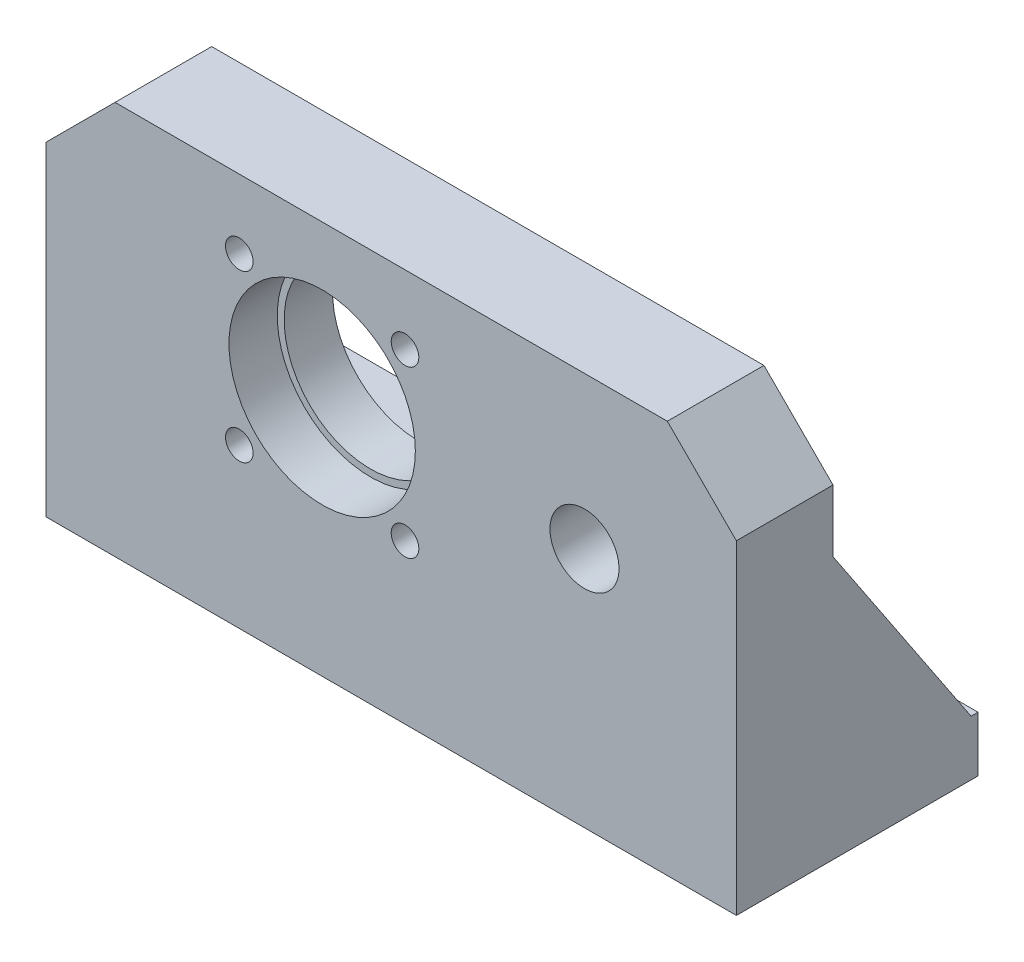
ISO-10303-21;
HEADER;
FILE_DESCRIPTION(('STEP AP214'),'2;1');
FILE_NAME('part.step','',(''),(''),'','','');
FILE_SCHEMA(('AUTOMOTIVE_DESIGN { 1 0 10303 214 1 1 1 1 }'));
ENDSEC;
DATA;
#1=APPLICATION_CONTEXT('core data for automotive mechanical design processes');
#2=APPLICATION_PROTOCOL_DEFINITION('international standard','automotive_design',2000,#1);
#3=PRODUCT_CONTEXT('',#1,'mechanical');
#4=PRODUCT('Part','Part','',(#3));
#5=PRODUCT_RELATED_PRODUCT_CATEGORY('part','',(#4));
#6=PRODUCT_DEFINITION_FORMATION('','',#4);
#7=PRODUCT_DEFINITION_CONTEXT('part definition',#1,'design');
#8=PRODUCT_DEFINITION('design','',#6,#7);
#9=PRODUCT_DEFINITION_SHAPE('','',#8);
#10=(LENGTH_UNIT() NAMED_UNIT(*) SI_UNIT(.MILLI.,.METRE.));
#11=(NAMED_UNIT(*) PLANE_ANGLE_UNIT() SI_UNIT($,.RADIAN.));
#12=(NAMED_UNIT(*) SI_UNIT($,.STERADIAN.) SOLID_ANGLE_UNIT());
#13=UNCERTAINTY_MEASURE_WITH_UNIT(LENGTH_MEASURE(1.E-05),#10,'distance_accuracy_value','');
#14=(GEOMETRIC_REPRESENTATION_CONTEXT(3) GLOBAL_UNCERTAINTY_ASSIGNED_CONTEXT((#13)) GLOBAL_UNIT_ASSIGNED_CONTEXT((#10,
#11,#12)) REPRESENTATION_CONTEXT('',''));
#15=CARTESIAN_POINT('',(0.,0.,0.));
#16=DIRECTION('',(0.,0.,1.));
#17=DIRECTION('',(1.,0.,0.));
#18=AXIS2_PLACEMENT_3D('',#15,#16,#17);
#19=CARTESIAN_POINT('',(0.,0.,-14.));
#20=DIRECTION('',(0.,0.,-1.));
#21=DIRECTION('',(1.,0.,0.));
#22=AXIS2_PLACEMENT_3D('',#19,#20,#21);
#23=PLANE('',#22);
#24=CARTESIAN_POINT('',(38.,0.,-14.));
#25=DIRECTION('',(0.,0.,1.));
#26=DIRECTION('',(1.,0.,0.));
#27=AXIS2_PLACEMENT_3D('',#24,#25,#26);
#28=CIRCLE('',#27,5.);
#29=CARTESIAN_POINT('',(43.,0.,-14.));
#30=VERTEX_POINT('',#29);
#31=EDGE_CURVE('E163',#30,#30,#28,.T.);
#32=ORIENTED_EDGE('',*,*,#31,.T.);
#33=EDGE_LOOP('',(#32));
#34=FACE_BOUND('',#33,.T.);
#35=CARTESIAN_POINT('',(0.,0.,-14.));
#36=DIRECTION('',(0.,0.,1.));
#37=DIRECTION('',(1.,0.,0.));
#38=AXIS2_PLACEMENT_3D('',#35,#36,#37);
#39=CIRCLE('',#38,12.5);
#40=CARTESIAN_POINT('',(12.5,0.,-14.));
#41=VERTEX_POINT('',#40);
#42=EDGE_CURVE('E254',#41,#41,#39,.T.);
#43=ORIENTED_EDGE('',*,*,#42,.T.);
#44=EDGE_LOOP('',(#43));
#45=FACE_BOUND('',#44,.T.);
#46=DIRECTION('',(-1.,0.,0.));
#47=VECTOR('',#46,1.);
#48=CARTESIAN_POINT('',(60.,22.,-14.));
#49=LINE('',#48,#47);
#50=CARTESIAN_POINT('',(50.,22.,-14.));
#51=VERTEX_POINT('',#50);
#52=CARTESIAN_POINT('',(-30.,22.,-14.));
#53=VERTEX_POINT('',#52);
#54=EDGE_CURVE('E279',#51,#53,#49,.T.);
#55=ORIENTED_EDGE('',*,*,#54,.F.);
#56=DIRECTION('',(-0.707106781186549,0.707106781186546,0.));
#57=VECTOR('',#56,1.);
#58=CARTESIAN_POINT('',(35.9999999999999,36.,-14.));
#59=LINE('',#58,#57);
#60=CARTESIAN_POINT('',(60.,12.,-14.));
#61=VERTEX_POINT('',#60);
#62=EDGE_CURVE('E52',#51,#61,#59,.F.);
#63=ORIENTED_EDGE('',*,*,#62,.T.);
#64=DIRECTION('',(0.,1.,0.));
#65=VECTOR('',#64,1.);
#66=CARTESIAN_POINT('',(60.,-35.,-14.));
#67=LINE('',#66,#65);
#68=CARTESIAN_POINT('',(60.,2.99999999999999,-14.));
#69=VERTEX_POINT('',#68);
#70=EDGE_CURVE('E274',#69,#61,#67,.T.);
#71=ORIENTED_EDGE('',*,*,#70,.F.);
#72=DIRECTION('',(1.,0.,0.));
#73=VECTOR('',#72,1.);
#74=CARTESIAN_POINT('',(52.,2.99999999999999,-14.));
#75=LINE('',#74,#73);
#76=CARTESIAN_POINT('',(52.,2.99999999999999,-14.));
#77=VERTEX_POINT('',#76);
#78=EDGE_CURVE('E218',#77,#69,#75,.T.);
#79=ORIENTED_EDGE('',*,*,#78,.F.);
#80=DIRECTION('',(0.,1.,0.));
#81=VECTOR('',#80,1.);
#82=CARTESIAN_POINT('',(52.,-27.,-14.));
#83=LINE('',#82,#81);
#84=CARTESIAN_POINT('',(52.,-27.,-14.));
#85=VERTEX_POINT('',#84);
#86=EDGE_CURVE('E211',#85,#77,#83,.T.);
#87=ORIENTED_EDGE('',*,*,#86,.F.);
#88=DIRECTION('',(-1.,0.,0.));
#89=VECTOR('',#88,1.);
#90=CARTESIAN_POINT('',(0.,-27.,-14.));
#91=LINE('',#90,#89);
#92=CARTESIAN_POINT('',(-32.,-27.,-14.));
#93=VERTEX_POINT('',#92);
#94=EDGE_CURVE('E248',#85,#93,#91,.T.);
#95=ORIENTED_EDGE('',*,*,#94,.T.);
#96=DIRECTION('',(0.,1.,0.));
#97=VECTOR('',#96,1.);
#98=CARTESIAN_POINT('',(-32.,-27.,-14.));
#99=LINE('',#98,#97);
#100=CARTESIAN_POINT('',(-32.,2.99999999999998,-14.));
#101=VERTEX_POINT('',#100);
#102=EDGE_CURVE('E193',#93,#101,#99,.T.);
#103=ORIENTED_EDGE('',*,*,#102,.T.);
#104=DIRECTION('',(-1.,0.,0.));
#105=VECTOR('',#104,1.);
#106=CARTESIAN_POINT('',(-32.,2.99999999999998,-14.));
#107=LINE('',#106,#105);
#108=CARTESIAN_POINT('',(-40.,2.99999999999998,-14.));
#109=VERTEX_POINT('',#108);
#110=EDGE_CURVE('E200',#101,#109,#107,.T.);
#111=ORIENTED_EDGE('',*,*,#110,.T.);
#112=DIRECTION('',(0.,-1.,0.));
#113=VECTOR('',#112,1.);
#114=CARTESIAN_POINT('',(-40.,22.,-14.));
#115=LINE('',#114,#113);
#116=CARTESIAN_POINT('',(-40.,11.9999999999999,-14.));
#117=VERTEX_POINT('',#116);
#118=EDGE_CURVE('E271',#117,#109,#115,.T.);
#119=ORIENTED_EDGE('',*,*,#118,.F.);
#120=DIRECTION('',(-0.707106781186546,-0.707106781186549,0.));
#121=VECTOR('',#120,1.);
#122=CARTESIAN_POINT('',(-26.,26.,-14.));
#123=LINE('',#122,#121);
#124=EDGE_CURVE('E64',#117,#53,#123,.F.);
#125=ORIENTED_EDGE('',*,*,#124,.T.);
#126=EDGE_LOOP('',(#55,#63,#71,#79,#87,#95,#103,#111,#119,#125));
#127=FACE_BOUND('',#126,.T.);
#128=ADVANCED_FACE('F42',(#34,#45,#127),#23,.T.);
#129=CARTESIAN_POINT('',(0.,-27.,0.));
#130=DIRECTION('',(0.,1.,0.));
#131=DIRECTION('',(0.,0.,-1.));
#132=AXIS2_PLACEMENT_3D('',#129,#130,#131);
#133=PLANE('',#132);
#134=DIRECTION('',(0.,0.,1.));
#135=VECTOR('',#134,1.);
#136=CARTESIAN_POINT('',(-32.,-27.,-34.));
#137=LINE('',#136,#135);
#138=CARTESIAN_POINT('',(-32.,-27.,-34.));
#139=VERTEX_POINT('',#138);
#140=EDGE_CURVE('E187',#139,#93,#137,.T.);
#141=ORIENTED_EDGE('',*,*,#140,.T.);
#142=ORIENTED_EDGE('',*,*,#94,.F.);
#143=DIRECTION('',(0.,0.,1.));
#144=VECTOR('',#143,1.);
#145=CARTESIAN_POINT('',(52.,-27.,-34.));
#146=LINE('',#145,#144);
#147=CARTESIAN_POINT('',(52.,-27.,-34.));
#148=VERTEX_POINT('',#147);
#149=EDGE_CURVE('E208',#148,#85,#146,.T.);
#150=ORIENTED_EDGE('',*,*,#149,.F.);
#151=DIRECTION('',(1.,0.,0.));
#152=VECTOR('',#151,1.);
#153=CARTESIAN_POINT('',(52.,-27.,-34.));
#154=LINE('',#153,#152);
#155=CARTESIAN_POINT('',(60.,-27.,-34.));
#156=VERTEX_POINT('',#155);
#157=EDGE_CURVE('E221',#148,#156,#154,.T.);
#158=ORIENTED_EDGE('',*,*,#157,.T.);
#159=DIRECTION('',(0.,0.,-1.));
#160=VECTOR('',#159,1.);
#161=CARTESIAN_POINT('',(60.,-27.,0.));
#162=LINE('',#161,#160);
#163=CARTESIAN_POINT('',(60.,-27.,-35.));
#164=VERTEX_POINT('',#163);
#165=EDGE_CURVE('E233',#156,#164,#162,.T.);
#166=ORIENTED_EDGE('',*,*,#165,.T.);
#167=DIRECTION('',(-1.,0.,0.));
#168=VECTOR('',#167,1.);
#169=CARTESIAN_POINT('',(-40.,-27.,-35.));
#170=LINE('',#169,#168);
#171=CARTESIAN_POINT('',(-40.,-27.,-35.));
#172=VERTEX_POINT('',#171);
#173=EDGE_CURVE('E237',#164,#172,#170,.T.);
#174=ORIENTED_EDGE('',*,*,#173,.T.);
#175=DIRECTION('',(0.,0.,1.));
#176=VECTOR('',#175,1.);
#177=CARTESIAN_POINT('',(-40.,-27.,0.));
#178=LINE('',#177,#176);
#179=CARTESIAN_POINT('',(-40.,-27.,-34.));
#180=VERTEX_POINT('',#179);
#181=EDGE_CURVE('E229',#172,#180,#178,.T.);
#182=ORIENTED_EDGE('',*,*,#181,.T.);
#183=DIRECTION('',(-1.,0.,0.));
#184=VECTOR('',#183,1.);
#185=CARTESIAN_POINT('',(-32.,-27.,-34.));
#186=LINE('',#185,#184);
#187=EDGE_CURVE('E197',#139,#180,#186,.T.);
#188=ORIENTED_EDGE('',*,*,#187,.F.);
#189=EDGE_LOOP('',(#141,#142,#150,#158,#166,#174,#182,#188));
#190=FACE_BOUND('',#189,.T.);
#191=ADVANCED_FACE('F352',(#190),#133,.T.);
#192=CARTESIAN_POINT('',(0.,0.,-14.));
#193=DIRECTION('',(0.,0.,1.));
#194=DIRECTION('',(-1.,0.,0.));
#195=AXIS2_PLACEMENT_3D('',#192,#193,#194);
#196=CYLINDRICAL_SURFACE('',#195,13.5);
#197=CARTESIAN_POINT('',(0.,0.,0.));
#198=DIRECTION('',(0.,0.,1.));
#199=DIRECTION('',(1.,0.,0.));
#200=AXIS2_PLACEMENT_3D('',#197,#198,#199);
#201=CIRCLE('',#200,13.5);
#202=CARTESIAN_POINT('',(13.5,0.,0.));
#203=VERTEX_POINT('',#202);
#204=EDGE_CURVE('E266',#203,#203,#201,.T.);
#205=ORIENTED_EDGE('',*,*,#204,.T.);
#206=EDGE_LOOP('',(#205));
#207=FACE_BOUND('',#206,.T.);
#208=CARTESIAN_POINT('',(0.,0.,-7.));
#209=DIRECTION('',(0.,0.,1.));
#210=DIRECTION('',(1.,0.,0.));
#211=AXIS2_PLACEMENT_3D('',#208,#209,#210);
#212=CIRCLE('',#211,13.5);
#213=CARTESIAN_POINT('',(13.5,0.,-7.));
#214=VERTEX_POINT('',#213);
#215=EDGE_CURVE('E259',#214,#214,#212,.T.);
#216=ORIENTED_EDGE('',*,*,#215,.F.);
#217=EDGE_LOOP('',(#216));
#218=FACE_BOUND('',#217,.T.);
#219=ADVANCED_FACE('F387',(#207,#218),#196,.F.);
#220=CARTESIAN_POINT('',(0.,0.,0.));
#221=DIRECTION('',(0.,0.,-1.));
#222=DIRECTION('',(1.,0.,0.));
#223=AXIS2_PLACEMENT_3D('',#220,#221,#222);
#224=PLANE('',#223);
#225=CARTESIAN_POINT('',(38.,0.,0.));
#226=DIRECTION('',(0.,0.,-1.));
#227=DIRECTION('',(-1.,0.,0.));
#228=AXIS2_PLACEMENT_3D('',#225,#226,#227);
#229=CIRCLE('',#228,5.);
#230=CARTESIAN_POINT('',(33.,0.,0.));
#231=VERTEX_POINT('',#230);
#232=EDGE_CURVE('E650',#231,#231,#229,.T.);
#233=ORIENTED_EDGE('',*,*,#232,.T.);
#234=EDGE_LOOP('',(#233));
#235=FACE_BOUND('',#234,.T.);
#236=CARTESIAN_POINT('',(12.,12.,0.));
#237=DIRECTION('',(0.,0.,-1.));
#238=DIRECTION('',(-1.,0.,0.));
#239=AXIS2_PLACEMENT_3D('',#236,#237,#238);
#240=CIRCLE('',#239,1.99999999999999);
#241=CARTESIAN_POINT('',(10.,12.,0.));
#242=VERTEX_POINT('',#241);
#243=EDGE_CURVE('E155',#242,#242,#240,.T.);
#244=ORIENTED_EDGE('',*,*,#243,.T.);
#245=EDGE_LOOP('',(#244));
#246=FACE_BOUND('',#245,.T.);
#247=CARTESIAN_POINT('',(-12.,12.,0.));
#248=DIRECTION('',(0.,0.,-1.));
#249=DIRECTION('',(-1.,0.,0.));
#250=AXIS2_PLACEMENT_3D('',#247,#248,#249);
#251=CIRCLE('',#250,1.99999999999999);
#252=CARTESIAN_POINT('',(-14.,12.,0.));
#253=VERTEX_POINT('',#252);
#254=EDGE_CURVE('E154',#253,#253,#251,.T.);
#255=ORIENTED_EDGE('',*,*,#254,.T.);
#256=EDGE_LOOP('',(#255));
#257=FACE_BOUND('',#256,.T.);
#258=CARTESIAN_POINT('',(-12.,-12.,0.));
#259=DIRECTION('',(0.,0.,-1.));
#260=DIRECTION('',(-1.,0.,0.));
#261=AXIS2_PLACEMENT_3D('',#258,#259,#260);
#262=CIRCLE('',#261,1.99999999999999);
#263=CARTESIAN_POINT('',(-14.,-12.,0.));
#264=VERTEX_POINT('',#263);
#265=EDGE_CURVE('E170',#264,#264,#262,.T.);
#266=ORIENTED_EDGE('',*,*,#265,.T.);
#267=EDGE_LOOP('',(#266));
#268=FACE_BOUND('',#267,.T.);
#269=CARTESIAN_POINT('',(12.,-12.,0.));
#270=DIRECTION('',(0.,0.,-1.));
#271=DIRECTION('',(-1.,0.,0.));
#272=AXIS2_PLACEMENT_3D('',#269,#270,#271);
#273=CIRCLE('',#272,1.99999999999999);
#274=CARTESIAN_POINT('',(10.,-12.,0.));
#275=VERTEX_POINT('',#274);
#276=EDGE_CURVE('E178',#275,#275,#273,.T.);
#277=ORIENTED_EDGE('',*,*,#276,.T.);
#278=EDGE_LOOP('',(#277));
#279=FACE_BOUND('',#278,.T.);
#280=DIRECTION('',(0.,1.,0.));
#281=VECTOR('',#280,1.);
#282=CARTESIAN_POINT('',(60.,3.08001347194307,0.));
#283=LINE('',#282,#281);
#284=CARTESIAN_POINT('',(60.,-35.,0.));
#285=VERTEX_POINT('',#284);
#286=CARTESIAN_POINT('',(60.,12.,0.));
#287=VERTEX_POINT('',#286);
#288=EDGE_CURVE('E289',#285,#287,#283,.T.);
#289=ORIENTED_EDGE('',*,*,#288,.T.);
#290=DIRECTION('',(0.707106781186549,-0.707106781186546,0.));
#291=VECTOR('',#290,1.);
#292=CARTESIAN_POINT('',(60.,12.,0.));
#293=LINE('',#292,#291);
#294=CARTESIAN_POINT('',(50.,22.,0.));
#295=VERTEX_POINT('',#294);
#296=EDGE_CURVE('E309',#287,#295,#293,.F.);
#297=ORIENTED_EDGE('',*,*,#296,.T.);
#298=DIRECTION('',(-1.,0.,0.));
#299=VECTOR('',#298,1.);
#300=CARTESIAN_POINT('',(60.,22.,0.));
#301=LINE('',#300,#299);
#302=CARTESIAN_POINT('',(-30.,22.,0.));
#303=VERTEX_POINT('',#302);
#304=EDGE_CURVE('E275',#295,#303,#301,.T.);
#305=ORIENTED_EDGE('',*,*,#304,.T.);
#306=DIRECTION('',(0.707106781186546,0.707106781186549,0.));
#307=VECTOR('',#306,1.);
#308=CARTESIAN_POINT('',(-30.,22.,0.));
#309=LINE('',#308,#307);
#310=CARTESIAN_POINT('',(-40.,11.9999999999999,0.));
#311=VERTEX_POINT('',#310);
#312=EDGE_CURVE('E306',#303,#311,#309,.F.);
#313=ORIENTED_EDGE('',*,*,#312,.T.);
#314=DIRECTION('',(0.,-1.,0.));
#315=VECTOR('',#314,1.);
#316=CARTESIAN_POINT('',(-40.,-8.00000000000001,0.));
#317=LINE('',#316,#315);
#318=CARTESIAN_POINT('',(-40.,-35.,0.));
#319=VERTEX_POINT('',#318);
#320=EDGE_CURVE('E270',#311,#319,#317,.T.);
#321=ORIENTED_EDGE('',*,*,#320,.T.);
#322=DIRECTION('',(1.,0.,0.));
#323=VECTOR('',#322,1.);
#324=CARTESIAN_POINT('',(-40.,-35.,0.));
#325=LINE('',#324,#323);
#326=EDGE_CURVE('E285',#319,#285,#325,.T.);
#327=ORIENTED_EDGE('',*,*,#326,.T.);
#328=EDGE_LOOP('',(#289,#297,#305,#313,#321,#327));
#329=FACE_BOUND('',#328,.T.);
#330=ORIENTED_EDGE('',*,*,#204,.F.);
#331=EDGE_LOOP('',(#330));
#332=FACE_BOUND('',#331,.T.);
#333=ADVANCED_FACE('F334',(#235,#246,#257,#268,#279,#329,#332),#224,.F.);
#334=CARTESIAN_POINT('',(-40.,-8.00000000000001,-14.));
#335=DIRECTION('',(1.,0.,0.));
#336=DIRECTION('',(0.,0.,1.));
#337=AXIS2_PLACEMENT_3D('',#334,#335,#336);
#338=PLANE('',#337);
#339=ORIENTED_EDGE('',*,*,#320,.F.);
#340=DIRECTION('',(0.,0.,-1.));
#341=VECTOR('',#340,1.);
#342=CARTESIAN_POINT('',(-40.,11.9999999999999,-14.));
#343=LINE('',#342,#341);
#344=EDGE_CURVE('E11',#311,#117,#343,.T.);
#345=ORIENTED_EDGE('',*,*,#344,.T.);
#346=ORIENTED_EDGE('',*,*,#118,.T.);
#347=DIRECTION('',(0.,-0.832050294337844,-0.554700196225229));
#348=VECTOR('',#347,1.);
#349=CARTESIAN_POINT('',(-40.,-27.,-34.));
#350=LINE('',#349,#348);
#351=EDGE_CURVE('E186',#109,#180,#350,.T.);
#352=ORIENTED_EDGE('',*,*,#351,.T.);
#353=ORIENTED_EDGE('',*,*,#181,.F.);
#354=DIRECTION('',(0.,-1.,0.));
#355=VECTOR('',#354,1.);
#356=CARTESIAN_POINT('',(-40.,-27.,-35.));
#357=LINE('',#356,#355);
#358=CARTESIAN_POINT('',(-40.,-35.,-35.));
#359=VERTEX_POINT('',#358);
#360=EDGE_CURVE('E244',#172,#359,#357,.T.);
#361=ORIENTED_EDGE('',*,*,#360,.T.);
#362=DIRECTION('',(0.,0.,1.));
#363=VECTOR('',#362,1.);
#364=CARTESIAN_POINT('',(-40.,-35.,-14.));
#365=LINE('',#364,#363);
#366=EDGE_CURVE('E298',#359,#319,#365,.T.);
#367=ORIENTED_EDGE('',*,*,#366,.T.);
#368=EDGE_LOOP('',(#339,#345,#346,#352,#353,#361,#367));
#369=FACE_BOUND('',#368,.T.);
#370=ADVANCED_FACE('F340',(#369),#338,.F.);
#371=CARTESIAN_POINT('',(-40.,-35.,-14.));
#372=DIRECTION('',(0.,1.,0.));
#373=DIRECTION('',(0.,0.,-1.));
#374=AXIS2_PLACEMENT_3D('',#371,#372,#373);
#375=PLANE('',#374);
#376=ORIENTED_EDGE('',*,*,#326,.F.);
#377=ORIENTED_EDGE('',*,*,#366,.F.);
#378=DIRECTION('',(-1.,0.,0.));
#379=VECTOR('',#378,1.);
#380=CARTESIAN_POINT('',(-40.,-35.,-35.));
#381=LINE('',#380,#379);
#382=CARTESIAN_POINT('',(60.,-35.,-35.));
#383=VERTEX_POINT('',#382);
#384=EDGE_CURVE('E225',#383,#359,#381,.T.);
#385=ORIENTED_EDGE('',*,*,#384,.F.);
#386=DIRECTION('',(0.,0.,1.));
#387=VECTOR('',#386,1.);
#388=CARTESIAN_POINT('',(60.,-35.,-14.));
#389=LINE('',#388,#387);
#390=EDGE_CURVE('E282',#383,#285,#389,.T.);
#391=ORIENTED_EDGE('',*,*,#390,.T.);
#392=EDGE_LOOP('',(#376,#377,#385,#391));
#393=FACE_BOUND('',#392,.T.);
#394=ADVANCED_FACE('F346',(#393),#375,.F.);
#395=CARTESIAN_POINT('',(60.,3.08001347194307,-14.));
#396=DIRECTION('',(-1.,0.,0.));
#397=DIRECTION('',(0.,0.,-1.));
#398=AXIS2_PLACEMENT_3D('',#395,#396,#397);
#399=PLANE('',#398);
#400=ORIENTED_EDGE('',*,*,#70,.T.);
#401=DIRECTION('',(0.,0.,1.));
#402=VECTOR('',#401,1.);
#403=CARTESIAN_POINT('',(60.,12.,-14.));
#404=LINE('',#403,#402);
#405=EDGE_CURVE('E302',#61,#287,#404,.T.);
#406=ORIENTED_EDGE('',*,*,#405,.T.);
#407=ORIENTED_EDGE('',*,*,#288,.F.);
#408=ORIENTED_EDGE('',*,*,#390,.F.);
#409=DIRECTION('',(0.,-1.,0.));
#410=VECTOR('',#409,1.);
#411=CARTESIAN_POINT('',(60.,-27.,-35.));
#412=LINE('',#411,#410);
#413=EDGE_CURVE('E241',#164,#383,#412,.T.);
#414=ORIENTED_EDGE('',*,*,#413,.F.);
#415=ORIENTED_EDGE('',*,*,#165,.F.);
#416=DIRECTION('',(0.,-0.832050294337844,-0.554700196225229));
#417=VECTOR('',#416,1.);
#418=CARTESIAN_POINT('',(60.,-27.,-34.));
#419=LINE('',#418,#417);
#420=EDGE_CURVE('E204',#69,#156,#419,.T.);
#421=ORIENTED_EDGE('',*,*,#420,.F.);
#422=EDGE_LOOP('',(#400,#406,#407,#408,#414,#415,#421));
#423=FACE_BOUND('',#422,.T.);
#424=ADVANCED_FACE('F328',(#423),#399,.F.);
#425=CARTESIAN_POINT('',(60.,22.,-14.));
#426=DIRECTION('',(0.,-1.,0.));
#427=DIRECTION('',(1.,0.,0.));
#428=AXIS2_PLACEMENT_3D('',#425,#426,#427);
#429=PLANE('',#428);
#430=ORIENTED_EDGE('',*,*,#304,.F.);
#431=DIRECTION('',(0.,0.,-1.));
#432=VECTOR('',#431,1.);
#433=CARTESIAN_POINT('',(50.,22.,-14.));
#434=LINE('',#433,#432);
#435=EDGE_CURVE('E316',#295,#51,#434,.T.);
#436=ORIENTED_EDGE('',*,*,#435,.T.);
#437=ORIENTED_EDGE('',*,*,#54,.T.);
#438=DIRECTION('',(0.,0.,1.));
#439=VECTOR('',#438,1.);
#440=CARTESIAN_POINT('',(-30.,22.,-14.));
#441=LINE('',#440,#439);
#442=EDGE_CURVE('E312',#53,#303,#441,.T.);
#443=ORIENTED_EDGE('',*,*,#442,.T.);
#444=EDGE_LOOP('',(#430,#436,#437,#443));
#445=FACE_BOUND('',#444,.T.);
#446=ADVANCED_FACE('F337',(#445),#429,.F.);
#447=CARTESIAN_POINT('',(0.,0.,-7.));
#448=DIRECTION('',(0.,0.,-1.));
#449=DIRECTION('',(1.,0.,0.));
#450=AXIS2_PLACEMENT_3D('',#447,#448,#449);
#451=PLANE('',#450);
#452=CARTESIAN_POINT('',(0.,0.,-7.));
#453=DIRECTION('',(0.,0.,1.));
#454=DIRECTION('',(1.,0.,0.));
#455=AXIS2_PLACEMENT_3D('',#452,#453,#454);
#456=CIRCLE('',#455,12.5);
#457=CARTESIAN_POINT('',(12.5,0.,-7.));
#458=VERTEX_POINT('',#457);
#459=EDGE_CURVE('E255',#458,#458,#456,.T.);
#460=ORIENTED_EDGE('',*,*,#459,.F.);
#461=EDGE_LOOP('',(#460));
#462=FACE_BOUND('',#461,.T.);
#463=ORIENTED_EDGE('',*,*,#215,.T.);
#464=EDGE_LOOP('',(#463));
#465=FACE_BOUND('',#464,.T.);
#466=ADVANCED_FACE('F398',(#462,#465),#451,.F.);
#467=CARTESIAN_POINT('',(0.,0.,-7.));
#468=DIRECTION('',(0.,0.,-1.));
#469=DIRECTION('',(1.,0.,0.));
#470=AXIS2_PLACEMENT_3D('',#467,#468,#469);
#471=CYLINDRICAL_SURFACE('',#470,12.5);
#472=ORIENTED_EDGE('',*,*,#459,.T.);
#473=EDGE_LOOP('',(#472));
#474=FACE_BOUND('',#473,.T.);
#475=ORIENTED_EDGE('',*,*,#42,.F.);
#476=EDGE_LOOP('',(#475));
#477=FACE_BOUND('',#476,.T.);
#478=ADVANCED_FACE('F550',(#474,#477),#471,.F.);
#479=CARTESIAN_POINT('',(-40.,-27.,-35.));
#480=DIRECTION('',(0.,0.,-1.));
#481=DIRECTION('',(1.,0.,0.));
#482=AXIS2_PLACEMENT_3D('',#479,#480,#481);
#483=PLANE('',#482);
#484=ORIENTED_EDGE('',*,*,#384,.T.);
#485=ORIENTED_EDGE('',*,*,#360,.F.);
#486=ORIENTED_EDGE('',*,*,#173,.F.);
#487=ORIENTED_EDGE('',*,*,#413,.T.);
#488=EDGE_LOOP('',(#484,#485,#486,#487));
#489=FACE_BOUND('',#488,.T.);
#490=ADVANCED_FACE('F350',(#489),#483,.T.);
#491=CARTESIAN_POINT('',(52.,-27.,-34.));
#492=DIRECTION('',(0.,0.554700196225229,-0.832050294337844));
#493=DIRECTION('',(0.,-0.832050294337844,-0.554700196225229));
#494=AXIS2_PLACEMENT_3D('',#491,#492,#493);
#495=PLANE('',#494);
#496=ORIENTED_EDGE('',*,*,#420,.T.);
#497=ORIENTED_EDGE('',*,*,#157,.F.);
#498=DIRECTION('',(0.,-0.832050294337844,-0.554700196225229));
#499=VECTOR('',#498,1.);
#500=CARTESIAN_POINT('',(52.,-27.,-34.));
#501=LINE('',#500,#499);
#502=EDGE_CURVE('E215',#77,#148,#501,.T.);
#503=ORIENTED_EDGE('',*,*,#502,.F.);
#504=ORIENTED_EDGE('',*,*,#78,.T.);
#505=EDGE_LOOP('',(#496,#497,#503,#504));
#506=FACE_BOUND('',#505,.T.);
#507=ADVANCED_FACE('F357',(#506),#495,.T.);
#508=CARTESIAN_POINT('',(52.,0.,0.));
#509=DIRECTION('',(1.,0.,0.));
#510=DIRECTION('',(0.,0.,1.));
#511=AXIS2_PLACEMENT_3D('',#508,#509,#510);
#512=PLANE('',#511);
#513=ORIENTED_EDGE('',*,*,#149,.T.);
#514=ORIENTED_EDGE('',*,*,#86,.T.);
#515=ORIENTED_EDGE('',*,*,#502,.T.);
#516=EDGE_LOOP('',(#513,#514,#515));
#517=FACE_BOUND('',#516,.T.);
#518=ADVANCED_FACE('F360',(#517),#512,.F.);
#519=CARTESIAN_POINT('',(-32.,-27.,-34.));
#520=DIRECTION('',(0.,-0.554700196225229,0.832050294337844));
#521=DIRECTION('',(0.,0.832050294337844,0.554700196225229));
#522=AXIS2_PLACEMENT_3D('',#519,#520,#521);
#523=PLANE('',#522);
#524=ORIENTED_EDGE('',*,*,#351,.F.);
#525=ORIENTED_EDGE('',*,*,#110,.F.);
#526=DIRECTION('',(0.,-0.832050294337844,-0.554700196225229));
#527=VECTOR('',#526,1.);
#528=CARTESIAN_POINT('',(-32.,-27.,-34.));
#529=LINE('',#528,#527);
#530=EDGE_CURVE('E190',#101,#139,#529,.T.);
#531=ORIENTED_EDGE('',*,*,#530,.T.);
#532=ORIENTED_EDGE('',*,*,#187,.T.);
#533=EDGE_LOOP('',(#524,#525,#531,#532));
#534=FACE_BOUND('',#533,.T.);
#535=ADVANCED_FACE('F369',(#534),#523,.F.);
#536=CARTESIAN_POINT('',(-32.,0.,0.));
#537=DIRECTION('',(-1.,0.,0.));
#538=DIRECTION('',(0.,0.,1.));
#539=AXIS2_PLACEMENT_3D('',#536,#537,#538);
#540=PLANE('',#539);
#541=ORIENTED_EDGE('',*,*,#140,.F.);
#542=ORIENTED_EDGE('',*,*,#530,.F.);
#543=ORIENTED_EDGE('',*,*,#102,.F.);
#544=EDGE_LOOP('',(#541,#542,#543));
#545=FACE_BOUND('',#544,.T.);
#546=ADVANCED_FACE('F365',(#545),#540,.F.);
#547=CARTESIAN_POINT('',(12.,-12.,-9.99999999999999));
#548=DIRECTION('',(0.,0.,1.));
#549=DIRECTION('',(-1.,0.,0.));
#550=AXIS2_PLACEMENT_3D('',#547,#548,#549);
#551=CONICAL_SURFACE('',#550,1.99999999999999,1.02974425867665);
#552=CARTESIAN_POINT('',(12.,-12.,-11.2017212380551));
#553=VERTEX_POINT('',#552);
#554=VERTEX_LOOP('',#553);
#555=FACE_BOUND('',#554,.T.);
#556=CARTESIAN_POINT('',(12.,-12.,-9.99999999999999));
#557=DIRECTION('',(0.,0.,-1.));
#558=DIRECTION('',(-1.,0.,0.));
#559=AXIS2_PLACEMENT_3D('',#556,#557,#558);
#560=CIRCLE('',#559,1.99999999999999);
#561=CARTESIAN_POINT('',(10.,-12.,-9.99999999999999));
#562=VERTEX_POINT('',#561);
#563=EDGE_CURVE('E182',#562,#562,#560,.T.);
#564=ORIENTED_EDGE('',*,*,#563,.F.);
#565=EDGE_LOOP('',(#564));
#566=FACE_BOUND('',#565,.T.);
#567=ADVANCED_FACE('F376',(#555,#566),#551,.F.);
#568=CARTESIAN_POINT('',(12.,-12.,0.));
#569=DIRECTION('',(0.,0.,1.));
#570=DIRECTION('',(-1.,0.,0.));
#571=AXIS2_PLACEMENT_3D('',#568,#569,#570);
#572=CYLINDRICAL_SURFACE('',#571,1.99999999999999);
#573=ORIENTED_EDGE('',*,*,#563,.T.);
#574=EDGE_LOOP('',(#573));
#575=FACE_BOUND('',#574,.T.);
#576=ORIENTED_EDGE('',*,*,#276,.F.);
#577=EDGE_LOOP('',(#576));
#578=FACE_BOUND('',#577,.T.);
#579=ADVANCED_FACE('F435',(#575,#578),#572,.F.);
#580=CARTESIAN_POINT('',(-12.,-12.,-9.99999999999999));
#581=DIRECTION('',(0.,0.,1.));
#582=DIRECTION('',(-1.,0.,0.));
#583=AXIS2_PLACEMENT_3D('',#580,#581,#582);
#584=CONICAL_SURFACE('',#583,1.99999999999999,1.02974425867665);
#585=CARTESIAN_POINT('',(-12.,-12.,-11.2017212380551));
#586=VERTEX_POINT('',#585);
#587=VERTEX_LOOP('',#586);
#588=FACE_BOUND('',#587,.T.);
#589=CARTESIAN_POINT('',(-12.,-12.,-9.99999999999999));
#590=DIRECTION('',(0.,0.,-1.));
#591=DIRECTION('',(-1.,0.,0.));
#592=AXIS2_PLACEMENT_3D('',#589,#590,#591);
#593=CIRCLE('',#592,1.99999999999999);
#594=CARTESIAN_POINT('',(-14.,-12.,-9.99999999999999));
#595=VERTEX_POINT('',#594);
#596=EDGE_CURVE('E174',#595,#595,#593,.T.);
#597=ORIENTED_EDGE('',*,*,#596,.F.);
#598=EDGE_LOOP('',(#597));
#599=FACE_BOUND('',#598,.T.);
#600=ADVANCED_FACE('F431',(#588,#599),#584,.F.);
#601=CARTESIAN_POINT('',(-12.,-12.,0.));
#602=DIRECTION('',(0.,0.,1.));
#603=DIRECTION('',(-1.,0.,0.));
#604=AXIS2_PLACEMENT_3D('',#601,#602,#603);
#605=CYLINDRICAL_SURFACE('',#604,1.99999999999999);
#606=ORIENTED_EDGE('',*,*,#596,.T.);
#607=EDGE_LOOP('',(#606));
#608=FACE_BOUND('',#607,.T.);
#609=ORIENTED_EDGE('',*,*,#265,.F.);
#610=EDGE_LOOP('',(#609));
#611=FACE_BOUND('',#610,.T.);
#612=ADVANCED_FACE('F427',(#608,#611),#605,.F.);
#613=CARTESIAN_POINT('',(-12.,12.,-9.99999999999999));
#614=DIRECTION('',(0.,0.,1.));
#615=DIRECTION('',(-1.,0.,0.));
#616=AXIS2_PLACEMENT_3D('',#613,#614,#615);
#617=CONICAL_SURFACE('',#616,1.99999999999999,1.02974425867665);
#618=CARTESIAN_POINT('',(-12.,12.,-11.2017212380551));
#619=VERTEX_POINT('',#618);
#620=VERTEX_LOOP('',#619);
#621=FACE_BOUND('',#620,.T.);
#622=CARTESIAN_POINT('',(-12.,12.,-9.99999999999999));
#623=DIRECTION('',(0.,0.,-1.));
#624=DIRECTION('',(-1.,0.,0.));
#625=AXIS2_PLACEMENT_3D('',#622,#623,#624);
#626=CIRCLE('',#625,1.99999999999999);
#627=CARTESIAN_POINT('',(-14.,12.,-9.99999999999999));
#628=VERTEX_POINT('',#627);
#629=EDGE_CURVE('E160',#628,#628,#626,.T.);
#630=ORIENTED_EDGE('',*,*,#629,.F.);
#631=EDGE_LOOP('',(#630));
#632=FACE_BOUND('',#631,.T.);
#633=ADVANCED_FACE('F423',(#621,#632),#617,.F.);
#634=CARTESIAN_POINT('',(-12.,12.,0.));
#635=DIRECTION('',(0.,0.,1.));
#636=DIRECTION('',(-1.,0.,0.));
#637=AXIS2_PLACEMENT_3D('',#634,#635,#636);
#638=CYLINDRICAL_SURFACE('',#637,1.99999999999999);
#639=ORIENTED_EDGE('',*,*,#629,.T.);
#640=EDGE_LOOP('',(#639));
#641=FACE_BOUND('',#640,.T.);
#642=ORIENTED_EDGE('',*,*,#254,.F.);
#643=EDGE_LOOP('',(#642));
#644=FACE_BOUND('',#643,.T.);
#645=ADVANCED_FACE('F147',(#641,#644),#638,.F.);
#646=CARTESIAN_POINT('',(12.,12.,-9.99999999999999));
#647=DIRECTION('',(0.,0.,1.));
#648=DIRECTION('',(-1.,0.,0.));
#649=AXIS2_PLACEMENT_3D('',#646,#647,#648);
#650=CONICAL_SURFACE('',#649,1.99999999999999,1.02974425867665);
#651=CARTESIAN_POINT('',(12.,12.,-11.2017212380551));
#652=VERTEX_POINT('',#651);
#653=VERTEX_LOOP('',#652);
#654=FACE_BOUND('',#653,.T.);
#655=CARTESIAN_POINT('',(12.,12.,-9.99999999999999));
#656=DIRECTION('',(0.,0.,-1.));
#657=DIRECTION('',(-1.,0.,0.));
#658=AXIS2_PLACEMENT_3D('',#655,#656,#657);
#659=CIRCLE('',#658,1.99999999999999);
#660=CARTESIAN_POINT('',(10.,12.,-9.99999999999999));
#661=VERTEX_POINT('',#660);
#662=EDGE_CURVE('E151',#661,#661,#659,.T.);
#663=ORIENTED_EDGE('',*,*,#662,.F.);
#664=EDGE_LOOP('',(#663));
#665=FACE_BOUND('',#664,.T.);
#666=ADVANCED_FACE('F143',(#654,#665),#650,.F.);
#667=CARTESIAN_POINT('',(12.,12.,0.));
#668=DIRECTION('',(0.,0.,1.));
#669=DIRECTION('',(-1.,0.,0.));
#670=AXIS2_PLACEMENT_3D('',#667,#668,#669);
#671=CYLINDRICAL_SURFACE('',#670,1.99999999999999);
#672=ORIENTED_EDGE('',*,*,#662,.T.);
#673=EDGE_LOOP('',(#672));
#674=FACE_BOUND('',#673,.T.);
#675=ORIENTED_EDGE('',*,*,#243,.F.);
#676=EDGE_LOOP('',(#675));
#677=FACE_BOUND('',#676,.T.);
#678=ADVANCED_FACE('F146',(#674,#677),#671,.F.);
#679=CARTESIAN_POINT('',(38.,0.,-35.));
#680=DIRECTION('',(0.,0.,1.));
#681=DIRECTION('',(-1.,0.,0.));
#682=AXIS2_PLACEMENT_3D('',#679,#680,#681);
#683=CYLINDRICAL_SURFACE('',#682,5.);
#684=ORIENTED_EDGE('',*,*,#31,.F.);
#685=EDGE_LOOP('',(#684));
#686=FACE_BOUND('',#685,.T.);
#687=ORIENTED_EDGE('',*,*,#232,.F.);
#688=EDGE_LOOP('',(#687));
#689=FACE_BOUND('',#688,.T.);
#690=ADVANCED_FACE('F408',(#686,#689),#683,.F.);
#691=CARTESIAN_POINT('',(60.,12.,-14.));
#692=DIRECTION('',(-0.707106781186546,-0.707106781186549,0.));
#693=DIRECTION('',(0.,0.,1.));
#694=AXIS2_PLACEMENT_3D('',#691,#692,#693);
#695=PLANE('',#694);
#696=ORIENTED_EDGE('',*,*,#62,.F.);
#697=ORIENTED_EDGE('',*,*,#435,.F.);
#698=ORIENTED_EDGE('',*,*,#296,.F.);
#699=ORIENTED_EDGE('',*,*,#405,.F.);
#700=EDGE_LOOP('',(#696,#697,#698,#699));
#701=FACE_BOUND('',#700,.T.);
#702=ADVANCED_FACE('F331',(#701),#695,.F.);
#703=CARTESIAN_POINT('',(-30.,22.,-14.));
#704=DIRECTION('',(0.707106781186549,-0.707106781186546,0.));
#705=DIRECTION('',(0.,0.,1.));
#706=AXIS2_PLACEMENT_3D('',#703,#704,#705);
#707=PLANE('',#706);
#708=ORIENTED_EDGE('',*,*,#124,.F.);
#709=ORIENTED_EDGE('',*,*,#344,.F.);
#710=ORIENTED_EDGE('',*,*,#312,.F.);
#711=ORIENTED_EDGE('',*,*,#442,.F.);
#712=EDGE_LOOP('',(#708,#709,#710,#711));
#713=FACE_BOUND('',#712,.T.);
#714=ADVANCED_FACE('F45',(#713),#707,.F.);
#715=CLOSED_SHELL('',(#128,#191,#219,#333,#370,#394,#424,#446,#466,#478,#490,#507,#518,#535,
#546,#567,#579,#600,#612,#633,#645,#666,#678,#690,#702,#714));
#716=MANIFOLD_SOLID_BREP('B2',#715);
#717=ADVANCED_BREP_SHAPE_REPRESENTATION('',(#18,#716),#14);
#718=SHAPE_DEFINITION_REPRESENTATION(#9,#717);
ENDSEC;
END-ISO-10303-21;
